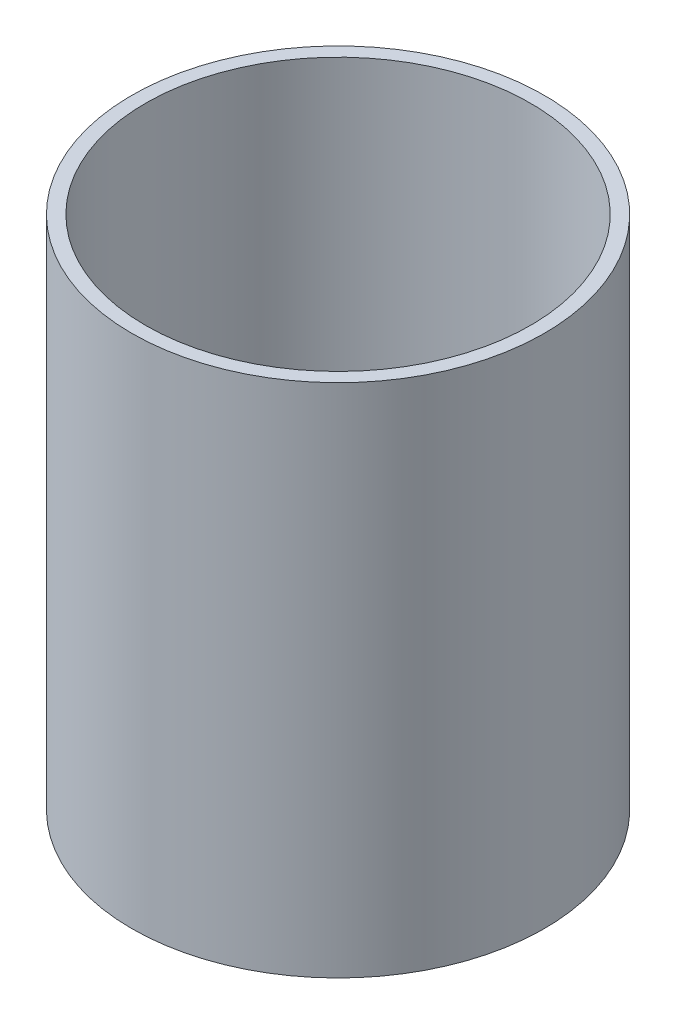
ISO-10303-21;
HEADER;
FILE_DESCRIPTION(('STEP AP214'),'2;1');
FILE_NAME('part.step','',(''),(''),'','','');
FILE_SCHEMA(('AUTOMOTIVE_DESIGN { 1 0 10303 214 1 1 1 1 }'));
ENDSEC;
DATA;
#1=APPLICATION_CONTEXT('core data for automotive mechanical design processes');
#2=APPLICATION_PROTOCOL_DEFINITION('international standard','automotive_design',2000,#1);
#3=PRODUCT_CONTEXT('',#1,'mechanical');
#4=PRODUCT('Part','Part','',(#3));
#5=PRODUCT_RELATED_PRODUCT_CATEGORY('part','',(#4));
#6=PRODUCT_DEFINITION_FORMATION('','',#4);
#7=PRODUCT_DEFINITION_CONTEXT('part definition',#1,'design');
#8=PRODUCT_DEFINITION('design','',#6,#7);
#9=PRODUCT_DEFINITION_SHAPE('','',#8);
#10=(LENGTH_UNIT() NAMED_UNIT(*) SI_UNIT(.MILLI.,.METRE.));
#11=(NAMED_UNIT(*) PLANE_ANGLE_UNIT() SI_UNIT($,.RADIAN.));
#12=(NAMED_UNIT(*) SI_UNIT($,.STERADIAN.) SOLID_ANGLE_UNIT());
#13=UNCERTAINTY_MEASURE_WITH_UNIT(LENGTH_MEASURE(1.E-05),#10,'distance_accuracy_value','');
#14=(GEOMETRIC_REPRESENTATION_CONTEXT(3) GLOBAL_UNCERTAINTY_ASSIGNED_CONTEXT((#13)) GLOBAL_UNIT_ASSIGNED_CONTEXT((#10,
#11,#12)) REPRESENTATION_CONTEXT('',''));
#15=CARTESIAN_POINT('',(0.,0.,0.));
#16=DIRECTION('',(0.,0.,1.));
#17=DIRECTION('',(1.,0.,0.));
#18=AXIS2_PLACEMENT_3D('',#15,#16,#17);
#19=CARTESIAN_POINT('',(0.,15.,0.));
#20=DIRECTION('',(0.,1.,0.));
#21=DIRECTION('',(0.,0.,1.));
#22=AXIS2_PLACEMENT_3D('',#19,#20,#21);
#23=PLANE('',#22);
#24=CARTESIAN_POINT('',(0.,15.,0.));
#25=DIRECTION('',(0.,1.,0.));
#26=DIRECTION('',(0.,0.,1.));
#27=AXIS2_PLACEMENT_3D('',#24,#25,#26);
#28=CIRCLE('',#27,6.);
#29=CARTESIAN_POINT('',(0.,15.,6.));
#30=VERTEX_POINT('',#29);
#31=EDGE_CURVE('E10',#30,#30,#28,.T.);
#32=ORIENTED_EDGE('',*,*,#31,.T.);
#33=EDGE_LOOP('',(#32));
#34=FACE_BOUND('',#33,.T.);
#35=CARTESIAN_POINT('',(0.,15.,0.));
#36=DIRECTION('',(0.,1.,0.));
#37=DIRECTION('',(0.,0.,1.));
#38=AXIS2_PLACEMENT_3D('',#35,#36,#37);
#39=CIRCLE('',#38,5.6);
#40=CARTESIAN_POINT('',(0.,15.,5.6));
#41=VERTEX_POINT('',#40);
#42=EDGE_CURVE('E50',#41,#41,#39,.T.);
#43=ORIENTED_EDGE('',*,*,#42,.F.);
#44=EDGE_LOOP('',(#43));
#45=FACE_BOUND('',#44,.T.);
#46=ADVANCED_FACE('F37',(#34,#45),#23,.T.);
#47=CARTESIAN_POINT('',(0.,0.,0.));
#48=DIRECTION('',(0.,1.,0.));
#49=DIRECTION('',(0.,0.,1.));
#50=AXIS2_PLACEMENT_3D('',#47,#48,#49);
#51=PLANE('',#50);
#52=CARTESIAN_POINT('',(0.,0.,0.));
#53=DIRECTION('',(0.,1.,0.));
#54=DIRECTION('',(0.,0.,1.));
#55=AXIS2_PLACEMENT_3D('',#52,#53,#54);
#56=CIRCLE('',#55,6.);
#57=CARTESIAN_POINT('',(0.,0.,6.));
#58=VERTEX_POINT('',#57);
#59=EDGE_CURVE('E41',#58,#58,#56,.T.);
#60=ORIENTED_EDGE('',*,*,#59,.F.);
#61=EDGE_LOOP('',(#60));
#62=FACE_BOUND('',#61,.T.);
#63=CARTESIAN_POINT('',(0.,0.,0.));
#64=DIRECTION('',(0.,1.,0.));
#65=DIRECTION('',(0.,0.,1.));
#66=AXIS2_PLACEMENT_3D('',#63,#64,#65);
#67=CIRCLE('',#66,5.6);
#68=CARTESIAN_POINT('',(0.,0.,5.6));
#69=VERTEX_POINT('',#68);
#70=EDGE_CURVE('E52',#69,#69,#67,.T.);
#71=ORIENTED_EDGE('',*,*,#70,.T.);
#72=EDGE_LOOP('',(#71));
#73=FACE_BOUND('',#72,.T.);
#74=ADVANCED_FACE('F64',(#62,#73),#51,.F.);
#75=CARTESIAN_POINT('',(0.,15.,0.));
#76=DIRECTION('',(0.,-1.,0.));
#77=DIRECTION('',(0.,0.,-1.));
#78=AXIS2_PLACEMENT_3D('',#75,#76,#77);
#79=CYLINDRICAL_SURFACE('',#78,6.);
#80=ORIENTED_EDGE('',*,*,#31,.F.);
#81=EDGE_LOOP('',(#80));
#82=FACE_BOUND('',#81,.T.);
#83=ORIENTED_EDGE('',*,*,#59,.T.);
#84=EDGE_LOOP('',(#83));
#85=FACE_BOUND('',#84,.T.);
#86=ADVANCED_FACE('F39',(#82,#85),#79,.T.);
#87=CARTESIAN_POINT('',(0.,15.,0.));
#88=DIRECTION('',(0.,-1.,0.));
#89=DIRECTION('',(0.,0.,-1.));
#90=AXIS2_PLACEMENT_3D('',#87,#88,#89);
#91=CYLINDRICAL_SURFACE('',#90,5.6);
#92=ORIENTED_EDGE('',*,*,#42,.T.);
#93=EDGE_LOOP('',(#92));
#94=FACE_BOUND('',#93,.T.);
#95=ORIENTED_EDGE('',*,*,#70,.F.);
#96=EDGE_LOOP('',(#95));
#97=FACE_BOUND('',#96,.T.);
#98=ADVANCED_FACE('F60',(#94,#97),#91,.F.);
#99=CLOSED_SHELL('',(#46,#74,#86,#98));
#100=MANIFOLD_SOLID_BREP('B2',#99);
#101=ADVANCED_BREP_SHAPE_REPRESENTATION('',(#18,#100),#14);
#102=SHAPE_DEFINITION_REPRESENTATION(#9,#101);
ENDSEC;
END-ISO-10303-21;
